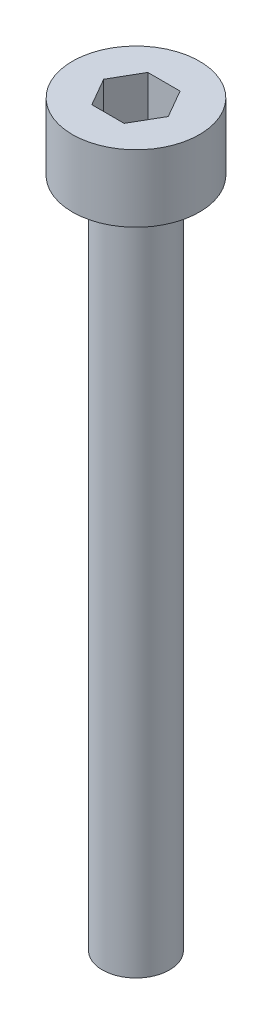
ISO-10303-21;
HEADER;
FILE_DESCRIPTION(('STEP AP214'),'2;1');
FILE_NAME('part.step','',(''),(''),'','','');
FILE_SCHEMA(('AUTOMOTIVE_DESIGN { 1 0 10303 214 1 1 1 1 }'));
ENDSEC;
DATA;
#1=APPLICATION_CONTEXT('core data for automotive mechanical design processes');
#2=APPLICATION_PROTOCOL_DEFINITION('international standard','automotive_design',2000,#1);
#3=PRODUCT_CONTEXT('',#1,'mechanical');
#4=PRODUCT('Part','Part','',(#3));
#5=PRODUCT_RELATED_PRODUCT_CATEGORY('part','',(#4));
#6=PRODUCT_DEFINITION_FORMATION('','',#4);
#7=PRODUCT_DEFINITION_CONTEXT('part definition',#1,'design');
#8=PRODUCT_DEFINITION('design','',#6,#7);
#9=PRODUCT_DEFINITION_SHAPE('','',#8);
#10=(LENGTH_UNIT() NAMED_UNIT(*) SI_UNIT(.MILLI.,.METRE.));
#11=(NAMED_UNIT(*) PLANE_ANGLE_UNIT() SI_UNIT($,.RADIAN.));
#12=(NAMED_UNIT(*) SI_UNIT($,.STERADIAN.) SOLID_ANGLE_UNIT());
#13=UNCERTAINTY_MEASURE_WITH_UNIT(LENGTH_MEASURE(1.E-05),#10,'distance_accuracy_value','');
#14=(GEOMETRIC_REPRESENTATION_CONTEXT(3) GLOBAL_UNCERTAINTY_ASSIGNED_CONTEXT((#13)) GLOBAL_UNIT_ASSIGNED_CONTEXT((#10,
#11,#12)) REPRESENTATION_CONTEXT('',''));
#15=CARTESIAN_POINT('',(0.,0.,0.));
#16=DIRECTION('',(0.,0.,1.));
#17=DIRECTION('',(1.,0.,0.));
#18=AXIS2_PLACEMENT_3D('',#15,#16,#17);
#19=CARTESIAN_POINT('',(0.,3.,0.));
#20=DIRECTION('',(0.,1.,0.));
#21=DIRECTION('',(0.,0.,1.));
#22=AXIS2_PLACEMENT_3D('',#19,#20,#21);
#23=PLANE('',#22);
#24=CARTESIAN_POINT('',(0.,3.,0.));
#25=DIRECTION('',(0.,1.,0.));
#26=DIRECTION('',(0.,0.,1.));
#27=AXIS2_PLACEMENT_3D('',#24,#25,#26);
#28=CIRCLE('',#27,2.84);
#29=CARTESIAN_POINT('',(0.,3.,2.84));
#30=VERTEX_POINT('',#29);
#31=EDGE_CURVE('E48',#30,#30,#28,.T.);
#32=ORIENTED_EDGE('',*,*,#31,.T.);
#33=EDGE_LOOP('',(#32));
#34=FACE_BOUND('',#33,.T.);
#35=DIRECTION('',(-1.,0.,0.));
#36=VECTOR('',#35,1.);
#37=CARTESIAN_POINT('',(0.721687836487032,3.,-1.25));
#38=LINE('',#37,#36);
#39=CARTESIAN_POINT('',(0.721687836487032,3.,-1.25));
#40=VERTEX_POINT('',#39);
#41=CARTESIAN_POINT('',(-0.721687836487032,3.,-1.25));
#42=VERTEX_POINT('',#41);
#43=EDGE_CURVE('E111',#40,#42,#38,.T.);
#44=ORIENTED_EDGE('',*,*,#43,.F.);
#45=DIRECTION('',(-0.5,0.,-0.866025403784438));
#46=VECTOR('',#45,1.);
#47=CARTESIAN_POINT('',(1.44337567297406,3.,0.));
#48=LINE('',#47,#46);
#49=CARTESIAN_POINT('',(1.44337567297406,3.,0.));
#50=VERTEX_POINT('',#49);
#51=EDGE_CURVE('E90',#50,#40,#48,.T.);
#52=ORIENTED_EDGE('',*,*,#51,.F.);
#53=DIRECTION('',(0.5,0.,-0.866025403784439));
#54=VECTOR('',#53,1.);
#55=CARTESIAN_POINT('',(0.721687836487032,3.,1.25));
#56=LINE('',#55,#54);
#57=CARTESIAN_POINT('',(0.721687836487032,3.,1.25));
#58=VERTEX_POINT('',#57);
#59=EDGE_CURVE('E61',#58,#50,#56,.T.);
#60=ORIENTED_EDGE('',*,*,#59,.F.);
#61=DIRECTION('',(1.,0.,0.));
#62=VECTOR('',#61,1.);
#63=CARTESIAN_POINT('',(-0.721687836487032,3.,1.25));
#64=LINE('',#63,#62);
#65=CARTESIAN_POINT('',(-0.721687836487032,3.,1.25));
#66=VERTEX_POINT('',#65);
#67=EDGE_CURVE('E123',#66,#58,#64,.T.);
#68=ORIENTED_EDGE('',*,*,#67,.F.);
#69=DIRECTION('',(0.5,0.,0.866025403784439));
#70=VECTOR('',#69,1.);
#71=CARTESIAN_POINT('',(-1.44337567297406,3.,0.));
#72=LINE('',#71,#70);
#73=CARTESIAN_POINT('',(-1.44337567297406,3.,0.));
#74=VERTEX_POINT('',#73);
#75=EDGE_CURVE('E110',#74,#66,#72,.T.);
#76=ORIENTED_EDGE('',*,*,#75,.F.);
#77=DIRECTION('',(-0.5,0.,0.866025403784439));
#78=VECTOR('',#77,1.);
#79=CARTESIAN_POINT('',(-0.721687836487032,3.,-1.25));
#80=LINE('',#79,#78);
#81=EDGE_CURVE('E99',#42,#74,#80,.T.);
#82=ORIENTED_EDGE('',*,*,#81,.F.);
#83=EDGE_LOOP('',(#44,#52,#60,#68,#76,#82));
#84=FACE_BOUND('',#83,.T.);
#85=ADVANCED_FACE('F39',(#34,#84),#23,.T.);
#86=CARTESIAN_POINT('',(0.,0.,0.));
#87=DIRECTION('',(0.,1.,0.));
#88=DIRECTION('',(0.,0.,1.));
#89=AXIS2_PLACEMENT_3D('',#86,#87,#88);
#90=PLANE('',#89);
#91=CARTESIAN_POINT('',(0.,0.,0.));
#92=DIRECTION('',(0.,1.,0.));
#93=DIRECTION('',(0.,0.,1.));
#94=AXIS2_PLACEMENT_3D('',#91,#92,#93);
#95=CIRCLE('',#94,1.5);
#96=CARTESIAN_POINT('',(0.,0.,1.5));
#97=VERTEX_POINT('',#96);
#98=EDGE_CURVE('E11',#97,#97,#95,.F.);
#99=ORIENTED_EDGE('',*,*,#98,.F.);
#100=EDGE_LOOP('',(#99));
#101=FACE_BOUND('',#100,.T.);
#102=CARTESIAN_POINT('',(0.,0.,0.));
#103=DIRECTION('',(0.,1.,0.));
#104=DIRECTION('',(0.,0.,1.));
#105=AXIS2_PLACEMENT_3D('',#102,#103,#104);
#106=CIRCLE('',#105,2.84);
#107=CARTESIAN_POINT('',(0.,0.,2.84));
#108=VERTEX_POINT('',#107);
#109=EDGE_CURVE('E166',#108,#108,#106,.T.);
#110=ORIENTED_EDGE('',*,*,#109,.F.);
#111=EDGE_LOOP('',(#110));
#112=FACE_BOUND('',#111,.T.);
#113=ADVANCED_FACE('F174',(#101,#112),#90,.F.);
#114=CARTESIAN_POINT('',(0.,3.,0.));
#115=DIRECTION('',(0.,-1.,0.));
#116=DIRECTION('',(0.,0.,-1.));
#117=AXIS2_PLACEMENT_3D('',#114,#115,#116);
#118=CYLINDRICAL_SURFACE('',#117,2.84);
#119=ORIENTED_EDGE('',*,*,#31,.F.);
#120=EDGE_LOOP('',(#119));
#121=FACE_BOUND('',#120,.T.);
#122=ORIENTED_EDGE('',*,*,#109,.T.);
#123=EDGE_LOOP('',(#122));
#124=FACE_BOUND('',#123,.T.);
#125=ADVANCED_FACE('F41',(#121,#124),#118,.T.);
#126=CARTESIAN_POINT('',(1.44337567297406,3.,0.));
#127=DIRECTION('',(-0.866025403784439,0.,0.5));
#128=DIRECTION('',(0.5,0.,0.866025403784439));
#129=AXIS2_PLACEMENT_3D('',#126,#127,#128);
#130=PLANE('',#129);
#131=DIRECTION('',(-0.5,0.,-0.866025403784438));
#132=VECTOR('',#131,1.);
#133=CARTESIAN_POINT('',(1.44337567297406,0.,0.));
#134=LINE('',#133,#132);
#135=CARTESIAN_POINT('',(1.44337567297406,0.,0.));
#136=VERTEX_POINT('',#135);
#137=CARTESIAN_POINT('',(0.721687836487032,0.,-1.25));
#138=VERTEX_POINT('',#137);
#139=EDGE_CURVE('E133',#136,#138,#134,.T.);
#140=ORIENTED_EDGE('',*,*,#139,.F.);
#141=DIRECTION('',(0.,-1.,0.));
#142=VECTOR('',#141,1.);
#143=CARTESIAN_POINT('',(1.44337567297406,3.,0.));
#144=LINE('',#143,#142);
#145=EDGE_CURVE('E132',#50,#136,#144,.T.);
#146=ORIENTED_EDGE('',*,*,#145,.F.);
#147=ORIENTED_EDGE('',*,*,#51,.T.);
#148=DIRECTION('',(0.,-1.,0.));
#149=VECTOR('',#148,1.);
#150=CARTESIAN_POINT('',(0.721687836487032,3.,-1.25));
#151=LINE('',#150,#149);
#152=EDGE_CURVE('E163',#40,#138,#151,.T.);
#153=ORIENTED_EDGE('',*,*,#152,.T.);
#154=EDGE_LOOP('',(#140,#146,#147,#153));
#155=FACE_BOUND('',#154,.T.);
#156=ADVANCED_FACE('F181',(#155),#130,.T.);
#157=CARTESIAN_POINT('',(0.721687836487032,3.,-1.25));
#158=DIRECTION('',(0.,0.,1.));
#159=DIRECTION('',(1.,0.,0.));
#160=AXIS2_PLACEMENT_3D('',#157,#158,#159);
#161=PLANE('',#160);
#162=DIRECTION('',(-1.,0.,0.));
#163=VECTOR('',#162,1.);
#164=CARTESIAN_POINT('',(0.721687836487032,0.,-1.25));
#165=LINE('',#164,#163);
#166=CARTESIAN_POINT('',(-0.721687836487032,0.,-1.25));
#167=VERTEX_POINT('',#166);
#168=EDGE_CURVE('E137',#138,#167,#165,.T.);
#169=ORIENTED_EDGE('',*,*,#168,.F.);
#170=ORIENTED_EDGE('',*,*,#152,.F.);
#171=ORIENTED_EDGE('',*,*,#43,.T.);
#172=DIRECTION('',(0.,-1.,0.));
#173=VECTOR('',#172,1.);
#174=CARTESIAN_POINT('',(-0.721687836487032,3.,-1.25));
#175=LINE('',#174,#173);
#176=EDGE_CURVE('E105',#42,#167,#175,.T.);
#177=ORIENTED_EDGE('',*,*,#176,.T.);
#178=EDGE_LOOP('',(#169,#170,#171,#177));
#179=FACE_BOUND('',#178,.T.);
#180=ADVANCED_FACE('F189',(#179),#161,.T.);
#181=CARTESIAN_POINT('',(-0.721687836487032,3.,-1.25));
#182=DIRECTION('',(0.866025403784439,0.,0.5));
#183=DIRECTION('',(0.5,0.,-0.866025403784439));
#184=AXIS2_PLACEMENT_3D('',#181,#182,#183);
#185=PLANE('',#184);
#186=DIRECTION('',(-0.5,0.,0.866025403784439));
#187=VECTOR('',#186,1.);
#188=CARTESIAN_POINT('',(-0.721687836487032,0.,-1.25));
#189=LINE('',#188,#187);
#190=CARTESIAN_POINT('',(-1.44337567297406,0.,0.));
#191=VERTEX_POINT('',#190);
#192=EDGE_CURVE('E142',#167,#191,#189,.T.);
#193=ORIENTED_EDGE('',*,*,#192,.F.);
#194=ORIENTED_EDGE('',*,*,#176,.F.);
#195=ORIENTED_EDGE('',*,*,#81,.T.);
#196=DIRECTION('',(0.,-1.,0.));
#197=VECTOR('',#196,1.);
#198=CARTESIAN_POINT('',(-1.44337567297406,3.,0.));
#199=LINE('',#198,#197);
#200=EDGE_CURVE('E103',#74,#191,#199,.T.);
#201=ORIENTED_EDGE('',*,*,#200,.T.);
#202=EDGE_LOOP('',(#193,#194,#195,#201));
#203=FACE_BOUND('',#202,.T.);
#204=ADVANCED_FACE('F102',(#203),#185,.T.);
#205=CARTESIAN_POINT('',(-1.44337567297406,3.,0.));
#206=DIRECTION('',(0.866025403784439,0.,-0.5));
#207=DIRECTION('',(-0.5,0.,-0.866025403784439));
#208=AXIS2_PLACEMENT_3D('',#205,#206,#207);
#209=PLANE('',#208);
#210=DIRECTION('',(0.5,0.,0.866025403784439));
#211=VECTOR('',#210,1.);
#212=CARTESIAN_POINT('',(-1.44337567297406,0.,0.));
#213=LINE('',#212,#211);
#214=CARTESIAN_POINT('',(-0.721687836487032,0.,1.25));
#215=VERTEX_POINT('',#214);
#216=EDGE_CURVE('E117',#191,#215,#213,.T.);
#217=ORIENTED_EDGE('',*,*,#216,.F.);
#218=ORIENTED_EDGE('',*,*,#200,.F.);
#219=ORIENTED_EDGE('',*,*,#75,.T.);
#220=DIRECTION('',(0.,-1.,0.));
#221=VECTOR('',#220,1.);
#222=CARTESIAN_POINT('',(-0.721687836487032,3.,1.25));
#223=LINE('',#222,#221);
#224=EDGE_CURVE('E120',#66,#215,#223,.T.);
#225=ORIENTED_EDGE('',*,*,#224,.T.);
#226=EDGE_LOOP('',(#217,#218,#219,#225));
#227=FACE_BOUND('',#226,.T.);
#228=ADVANCED_FACE('F114',(#227),#209,.T.);
#229=CARTESIAN_POINT('',(-0.721687836487032,3.,1.25));
#230=DIRECTION('',(0.,0.,-1.));
#231=DIRECTION('',(-1.,0.,0.));
#232=AXIS2_PLACEMENT_3D('',#229,#230,#231);
#233=PLANE('',#232);
#234=DIRECTION('',(1.,0.,0.));
#235=VECTOR('',#234,1.);
#236=CARTESIAN_POINT('',(-0.721687836487032,0.,1.25));
#237=LINE('',#236,#235);
#238=CARTESIAN_POINT('',(0.721687836487032,0.,1.25));
#239=VERTEX_POINT('',#238);
#240=EDGE_CURVE('E147',#215,#239,#237,.T.);
#241=ORIENTED_EDGE('',*,*,#240,.F.);
#242=ORIENTED_EDGE('',*,*,#224,.F.);
#243=ORIENTED_EDGE('',*,*,#67,.T.);
#244=DIRECTION('',(0.,-1.,0.));
#245=VECTOR('',#244,1.);
#246=CARTESIAN_POINT('',(0.721687836487032,3.,1.25));
#247=LINE('',#246,#245);
#248=EDGE_CURVE('E55',#58,#239,#247,.T.);
#249=ORIENTED_EDGE('',*,*,#248,.T.);
#250=EDGE_LOOP('',(#241,#242,#243,#249));
#251=FACE_BOUND('',#250,.T.);
#252=ADVANCED_FACE('F197',(#251),#233,.T.);
#253=CARTESIAN_POINT('',(0.721687836487032,3.,1.25));
#254=DIRECTION('',(-0.866025403784439,0.,-0.5));
#255=DIRECTION('',(-0.5,0.,0.866025403784439));
#256=AXIS2_PLACEMENT_3D('',#253,#254,#255);
#257=PLANE('',#256);
#258=DIRECTION('',(0.5,0.,-0.866025403784439));
#259=VECTOR('',#258,1.);
#260=CARTESIAN_POINT('',(0.721687836487032,0.,1.25));
#261=LINE('',#260,#259);
#262=EDGE_CURVE('E151',#239,#136,#261,.T.);
#263=ORIENTED_EDGE('',*,*,#262,.F.);
#264=ORIENTED_EDGE('',*,*,#248,.F.);
#265=ORIENTED_EDGE('',*,*,#59,.T.);
#266=ORIENTED_EDGE('',*,*,#145,.T.);
#267=EDGE_LOOP('',(#263,#264,#265,#266));
#268=FACE_BOUND('',#267,.T.);
#269=ADVANCED_FACE('F200',(#268),#257,.T.);
#270=CARTESIAN_POINT('',(0.,0.,0.));
#271=DIRECTION('',(0.,-1.,0.));
#272=DIRECTION('',(0.,0.,-1.));
#273=AXIS2_PLACEMENT_3D('',#270,#271,#272);
#274=PLANE('',#273);
#275=ORIENTED_EDGE('',*,*,#139,.T.);
#276=ORIENTED_EDGE('',*,*,#168,.T.);
#277=ORIENTED_EDGE('',*,*,#192,.T.);
#278=ORIENTED_EDGE('',*,*,#216,.T.);
#279=ORIENTED_EDGE('',*,*,#240,.T.);
#280=ORIENTED_EDGE('',*,*,#262,.T.);
#281=EDGE_LOOP('',(#275,#276,#277,#278,#279,#280));
#282=FACE_BOUND('',#281,.T.);
#283=ADVANCED_FACE('F203',(#282),#274,.F.);
#284=CARTESIAN_POINT('',(0.,-30.,0.));
#285=DIRECTION('',(0.,1.,0.));
#286=DIRECTION('',(0.,0.,1.));
#287=AXIS2_PLACEMENT_3D('',#284,#285,#286);
#288=CYLINDRICAL_SURFACE('',#287,1.5);
#289=CARTESIAN_POINT('',(0.,-30.,0.));
#290=DIRECTION('',(0.,-1.,0.));
#291=DIRECTION('',(0.,0.,-1.));
#292=AXIS2_PLACEMENT_3D('',#289,#290,#291);
#293=CIRCLE('',#292,1.5);
#294=CARTESIAN_POINT('',(0.,-30.,-1.5));
#295=VERTEX_POINT('',#294);
#296=EDGE_CURVE('E138',#295,#295,#293,.T.);
#297=ORIENTED_EDGE('',*,*,#296,.F.);
#298=EDGE_LOOP('',(#297));
#299=FACE_BOUND('',#298,.T.);
#300=ORIENTED_EDGE('',*,*,#98,.T.);
#301=EDGE_LOOP('',(#300));
#302=FACE_BOUND('',#301,.T.);
#303=ADVANCED_FACE('F204',(#299,#302),#288,.T.);
#304=CARTESIAN_POINT('',(0.,-30.,0.));
#305=DIRECTION('',(0.,-1.,0.));
#306=DIRECTION('',(0.,0.,-1.));
#307=AXIS2_PLACEMENT_3D('',#304,#305,#306);
#308=PLANE('',#307);
#309=ORIENTED_EDGE('',*,*,#296,.T.);
#310=EDGE_LOOP('',(#309));
#311=FACE_BOUND('',#310,.T.);
#312=ADVANCED_FACE('F207',(#311),#308,.T.);
#313=CLOSED_SHELL('',(#85,#113,#125,#156,#180,#204,#228,#252,#269,#283,#303,#312));
#314=MANIFOLD_SOLID_BREP('B2',#313);
#315=ADVANCED_BREP_SHAPE_REPRESENTATION('',(#18,#314),#14);
#316=SHAPE_DEFINITION_REPRESENTATION(#9,#315);
ENDSEC;
END-ISO-10303-21;
